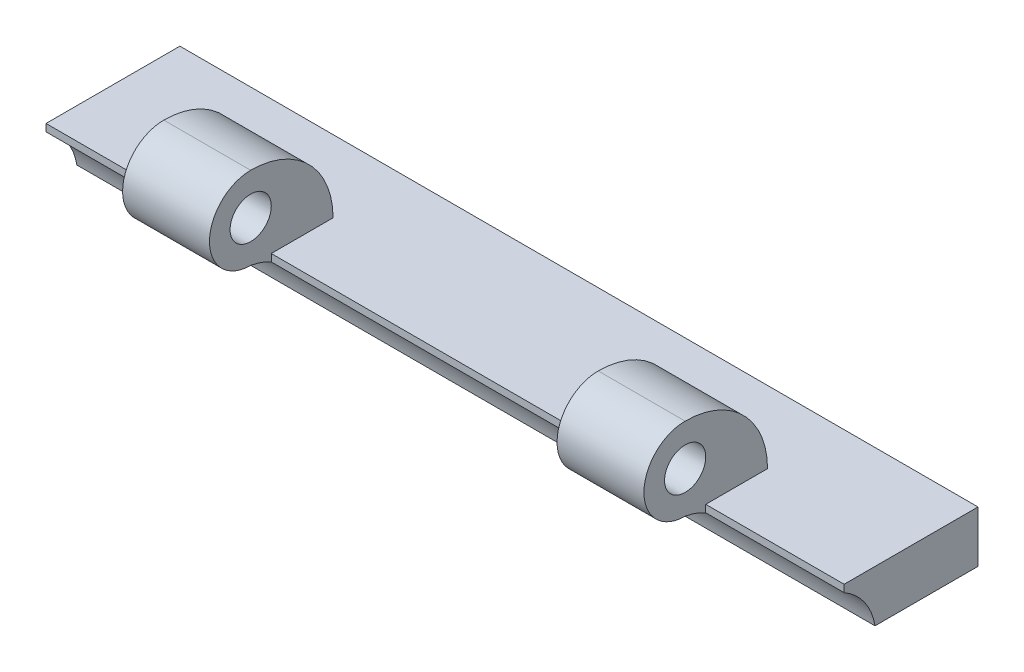
ISO-10303-21;
HEADER;
FILE_DESCRIPTION(('STEP AP214'),'2;1');
FILE_NAME('part.step','',(''),(''),'','','');
FILE_SCHEMA(('AUTOMOTIVE_DESIGN { 1 0 10303 214 1 1 1 1 }'));
ENDSEC;
DATA;
#1=APPLICATION_CONTEXT('core data for automotive mechanical design processes');
#2=APPLICATION_PROTOCOL_DEFINITION('international standard','automotive_design',2000,#1);
#3=PRODUCT_CONTEXT('',#1,'mechanical');
#4=PRODUCT('Part','Part','',(#3));
#5=PRODUCT_RELATED_PRODUCT_CATEGORY('part','',(#4));
#6=PRODUCT_DEFINITION_FORMATION('','',#4);
#7=PRODUCT_DEFINITION_CONTEXT('part definition',#1,'design');
#8=PRODUCT_DEFINITION('design','',#6,#7);
#9=PRODUCT_DEFINITION_SHAPE('','',#8);
#10=(LENGTH_UNIT() NAMED_UNIT(*) SI_UNIT(.MILLI.,.METRE.));
#11=(NAMED_UNIT(*) PLANE_ANGLE_UNIT() SI_UNIT($,.RADIAN.));
#12=(NAMED_UNIT(*) SI_UNIT($,.STERADIAN.) SOLID_ANGLE_UNIT());
#13=UNCERTAINTY_MEASURE_WITH_UNIT(LENGTH_MEASURE(1.E-05),#10,'distance_accuracy_value','');
#14=(GEOMETRIC_REPRESENTATION_CONTEXT(3) GLOBAL_UNCERTAINTY_ASSIGNED_CONTEXT((#13)) GLOBAL_UNIT_ASSIGNED_CONTEXT((#10,
#11,#12)) REPRESENTATION_CONTEXT('',''));
#15=CARTESIAN_POINT('',(0.,0.,0.));
#16=DIRECTION('',(0.,0.,1.));
#17=DIRECTION('',(1.,0.,0.));
#18=AXIS2_PLACEMENT_3D('',#15,#16,#17);
#19=CARTESIAN_POINT('',(-12.4387503050269,4.,75.1454545454545));
#20=DIRECTION('',(0.,0.,-1.));
#21=DIRECTION('',(-1.,0.,0.));
#22=AXIS2_PLACEMENT_3D('',#19,#20,#21);
#23=PLANE('',#22);
#24=DIRECTION('',(-1.,0.,0.));
#25=VECTOR('',#24,1.);
#26=CARTESIAN_POINT('',(-12.4387503050269,4.,75.1454545454545));
#27=LINE('',#26,#25);
#28=CARTESIAN_POINT('',(-23.75,4.,75.1454545454545));
#29=VERTEX_POINT('',#28);
#30=CARTESIAN_POINT('',(-37.25,4.,75.1454545454545));
#31=VERTEX_POINT('',#30);
#32=EDGE_CURVE('E170',#29,#31,#27,.T.);
#33=ORIENTED_EDGE('',*,*,#32,.T.);
#34=DIRECTION('',(0.,-1.,0.));
#35=VECTOR('',#34,1.);
#36=CARTESIAN_POINT('',(-37.25,0.,75.1454545454545));
#37=LINE('',#36,#35);
#38=CARTESIAN_POINT('',(-37.25,3.71660104885167,75.1454545454545));
#39=VERTEX_POINT('',#38);
#40=EDGE_CURVE('E152',#31,#39,#37,.T.);
#41=ORIENTED_EDGE('',*,*,#40,.T.);
#42=DIRECTION('',(1.,0.,0.));
#43=VECTOR('',#42,1.);
#44=CARTESIAN_POINT('',(-50.4721359549996,3.71660104885167,75.1454545454545));
#45=LINE('',#44,#43);
#46=CARTESIAN_POINT('',(-23.75,3.71660104885167,75.1454545454545));
#47=VERTEX_POINT('',#46);
#48=EDGE_CURVE('E245',#47,#39,#45,.F.);
#49=ORIENTED_EDGE('',*,*,#48,.F.);
#50=DIRECTION('',(0.,1.,0.));
#51=VECTOR('',#50,1.);
#52=CARTESIAN_POINT('',(-23.75,0.,75.1454545454545));
#53=LINE('',#52,#51);
#54=EDGE_CURVE('E176',#47,#29,#53,.T.);
#55=ORIENTED_EDGE('',*,*,#54,.T.);
#56=EDGE_LOOP('',(#33,#41,#49,#55));
#57=FACE_BOUND('',#56,.T.);
#58=ADVANCED_FACE('F42',(#57),#23,.F.);
#59=CARTESIAN_POINT('',(-15.,4.,75.1454545454545));
#60=VERTEX_POINT('',#59);
#61=CARTESIAN_POINT('',(-20.375,4.,75.1454545454545));
#62=VERTEX_POINT('',#61);
#63=EDGE_CURVE('E178',#60,#62,#27,.T.);
#64=ORIENTED_EDGE('',*,*,#63,.T.);
#65=DIRECTION('',(0.,-1.,0.));
#66=VECTOR('',#65,1.);
#67=CARTESIAN_POINT('',(-20.375,0.,75.1454545454545));
#68=LINE('',#67,#66);
#69=CARTESIAN_POINT('',(-20.375,3.71660104885167,75.1454545454545));
#70=VERTEX_POINT('',#69);
#71=EDGE_CURVE('E270',#62,#70,#68,.T.);
#72=ORIENTED_EDGE('',*,*,#71,.T.);
#73=CARTESIAN_POINT('',(-15.,3.71660104885167,75.1454545454545));
#74=VERTEX_POINT('',#73);
#75=EDGE_CURVE('E242',#74,#70,#45,.F.);
#76=ORIENTED_EDGE('',*,*,#75,.F.);
#77=DIRECTION('',(0.,1.,0.));
#78=VECTOR('',#77,1.);
#79=CARTESIAN_POINT('',(-15.,4.,75.1454545454545));
#80=LINE('',#79,#78);
#81=EDGE_CURVE('E182',#74,#60,#80,.T.);
#82=ORIENTED_EDGE('',*,*,#81,.T.);
#83=EDGE_LOOP('',(#64,#72,#76,#82));
#84=FACE_BOUND('',#83,.T.);
#85=ADVANCED_FACE('F317',(#84),#23,.F.);
#86=CARTESIAN_POINT('',(-46.,4.,64.1454545454545));
#87=DIRECTION('',(1.,0.,0.));
#88=DIRECTION('',(0.,0.,-1.));
#89=AXIS2_PLACEMENT_3D('',#86,#87,#88);
#90=PLANE('',#89);
#91=CARTESIAN_POINT('',(-46.,1.59999999999998,76.3454545454545));
#92=DIRECTION('',(1.,0.,0.));
#93=DIRECTION('',(0.,0.,-1.));
#94=AXIS2_PLACEMENT_3D('',#91,#92,#93);
#95=CIRCLE('',#94,2.43310501211931);
#96=CARTESIAN_POINT('',(-46.,2.,73.9454545454545));
#97=VERTEX_POINT('',#96);
#98=CARTESIAN_POINT('',(-46.,3.71660104885167,75.1454545454545));
#99=VERTEX_POINT('',#98);
#100=EDGE_CURVE('E247',#97,#99,#95,.T.);
#101=ORIENTED_EDGE('',*,*,#100,.T.);
#102=DIRECTION('',(0.,-1.,0.));
#103=VECTOR('',#102,1.);
#104=CARTESIAN_POINT('',(-46.,4.,75.1454545454545));
#105=LINE('',#104,#103);
#106=CARTESIAN_POINT('',(-46.,4.,75.1454545454545));
#107=VERTEX_POINT('',#106);
#108=EDGE_CURVE('E184',#107,#99,#105,.T.);
#109=ORIENTED_EDGE('',*,*,#108,.F.);
#110=DIRECTION('',(0.,0.,1.));
#111=VECTOR('',#110,1.);
#112=CARTESIAN_POINT('',(-46.,4.,64.1454545454545));
#113=LINE('',#112,#111);
#114=CARTESIAN_POINT('',(-46.,4.,69.9454545454545));
#115=VERTEX_POINT('',#114);
#116=EDGE_CURVE('E51',#115,#107,#113,.T.);
#117=ORIENTED_EDGE('',*,*,#116,.F.);
#118=DIRECTION('',(0.,1.,0.));
#119=VECTOR('',#118,1.);
#120=CARTESIAN_POINT('',(-46.,4.,69.9454545454545));
#121=LINE('',#120,#119);
#122=CARTESIAN_POINT('',(-46.,2.,69.9454545454545));
#123=VERTEX_POINT('',#122);
#124=EDGE_CURVE('E255',#123,#115,#121,.T.);
#125=ORIENTED_EDGE('',*,*,#124,.F.);
#126=DIRECTION('',(0.,0.,1.));
#127=VECTOR('',#126,1.);
#128=CARTESIAN_POINT('',(-46.,2.,64.1454545454545));
#129=LINE('',#128,#127);
#130=EDGE_CURVE('E188',#123,#97,#129,.T.);
#131=ORIENTED_EDGE('',*,*,#130,.T.);
#132=EDGE_LOOP('',(#101,#109,#117,#125,#131));
#133=FACE_BOUND('',#132,.T.);
#134=ADVANCED_FACE('F44',(#133),#90,.F.);
#135=CARTESIAN_POINT('',(-15.,4.,64.1454545454545));
#136=DIRECTION('',(-1.,0.,0.));
#137=DIRECTION('',(0.,0.,1.));
#138=AXIS2_PLACEMENT_3D('',#135,#136,#137);
#139=PLANE('',#138);
#140=CARTESIAN_POINT('',(-15.,1.59999999999998,76.3454545454545));
#141=DIRECTION('',(1.,0.,0.));
#142=DIRECTION('',(0.,0.,-1.));
#143=AXIS2_PLACEMENT_3D('',#140,#141,#142);
#144=CIRCLE('',#143,2.43310501211931);
#145=CARTESIAN_POINT('',(-15.,2.,73.9454545454545));
#146=VERTEX_POINT('',#145);
#147=EDGE_CURVE('E59',#74,#146,#144,.F.);
#148=ORIENTED_EDGE('',*,*,#147,.T.);
#149=DIRECTION('',(0.,0.,-1.));
#150=VECTOR('',#149,1.);
#151=CARTESIAN_POINT('',(-15.,2.,64.1454545454545));
#152=LINE('',#151,#150);
#153=CARTESIAN_POINT('',(-15.,2.,69.9454545454545));
#154=VERTEX_POINT('',#153);
#155=EDGE_CURVE('E46',#146,#154,#152,.T.);
#156=ORIENTED_EDGE('',*,*,#155,.T.);
#157=DIRECTION('',(0.,-1.,0.));
#158=VECTOR('',#157,1.);
#159=CARTESIAN_POINT('',(-15.,4.,69.9454545454545));
#160=LINE('',#159,#158);
#161=CARTESIAN_POINT('',(-15.,4.,69.9454545454545));
#162=VERTEX_POINT('',#161);
#163=EDGE_CURVE('E261',#162,#154,#160,.T.);
#164=ORIENTED_EDGE('',*,*,#163,.F.);
#165=DIRECTION('',(0.,0.,-1.));
#166=VECTOR('',#165,1.);
#167=CARTESIAN_POINT('',(-15.,4.,64.1454545454545));
#168=LINE('',#167,#166);
#169=EDGE_CURVE('E11',#60,#162,#168,.T.);
#170=ORIENTED_EDGE('',*,*,#169,.F.);
#171=ORIENTED_EDGE('',*,*,#81,.F.);
#172=EDGE_LOOP('',(#148,#156,#164,#170,#171));
#173=FACE_BOUND('',#172,.T.);
#174=ADVANCED_FACE('F304',(#173),#139,.F.);
#175=CARTESIAN_POINT('',(0.,2.,0.));
#176=DIRECTION('',(0.,1.,0.));
#177=DIRECTION('',(0.,0.,1.));
#178=AXIS2_PLACEMENT_3D('',#175,#176,#177);
#179=PLANE('',#178);
#180=DIRECTION('',(1.,0.,0.));
#181=VECTOR('',#180,1.);
#182=CARTESIAN_POINT('',(-50.4721359549996,2.,73.9454545454545));
#183=LINE('',#182,#181);
#184=EDGE_CURVE('E249',#97,#146,#183,.T.);
#185=ORIENTED_EDGE('',*,*,#184,.F.);
#186=ORIENTED_EDGE('',*,*,#130,.F.);
#187=DIRECTION('',(-1.,0.,0.));
#188=VECTOR('',#187,1.);
#189=CARTESIAN_POINT('',(-15.,2.,69.9454545454545));
#190=LINE('',#189,#188);
#191=EDGE_CURVE('E258',#154,#123,#190,.T.);
#192=ORIENTED_EDGE('',*,*,#191,.F.);
#193=ORIENTED_EDGE('',*,*,#155,.F.);
#194=EDGE_LOOP('',(#185,#186,#192,#193));
#195=FACE_BOUND('',#194,.T.);
#196=ADVANCED_FACE('F300',(#195),#179,.F.);
#197=CARTESIAN_POINT('',(-40.625,3.71660104885167,75.1454545454545));
#198=VERTEX_POINT('',#197);
#199=EDGE_CURVE('E246',#198,#99,#45,.F.);
#200=ORIENTED_EDGE('',*,*,#199,.F.);
#201=DIRECTION('',(0.,1.,0.));
#202=VECTOR('',#201,1.);
#203=CARTESIAN_POINT('',(-40.625,0.,75.1454545454545));
#204=LINE('',#203,#202);
#205=CARTESIAN_POINT('',(-40.625,4.,75.1454545454545));
#206=VERTEX_POINT('',#205);
#207=EDGE_CURVE('E164',#198,#206,#204,.T.);
#208=ORIENTED_EDGE('',*,*,#207,.T.);
#209=EDGE_CURVE('E179',#206,#107,#27,.T.);
#210=ORIENTED_EDGE('',*,*,#209,.T.);
#211=ORIENTED_EDGE('',*,*,#108,.T.);
#212=EDGE_LOOP('',(#200,#208,#210,#211));
#213=FACE_BOUND('',#212,.T.);
#214=ADVANCED_FACE('F294',(#213),#23,.F.);
#215=CARTESIAN_POINT('',(0.,4.,0.));
#216=DIRECTION('',(0.,1.,0.));
#217=DIRECTION('',(0.,0.,1.));
#218=AXIS2_PLACEMENT_3D('',#215,#216,#217);
#219=PLANE('',#218);
#220=ORIENTED_EDGE('',*,*,#169,.T.);
#221=DIRECTION('',(1.,0.,0.));
#222=VECTOR('',#221,1.);
#223=CARTESIAN_POINT('',(-15.,4.,69.9454545454545));
#224=LINE('',#223,#222);
#225=EDGE_CURVE('E252',#115,#162,#224,.T.);
#226=ORIENTED_EDGE('',*,*,#225,.F.);
#227=ORIENTED_EDGE('',*,*,#116,.T.);
#228=ORIENTED_EDGE('',*,*,#209,.F.);
#229=DIRECTION('',(0.,0.,1.));
#230=VECTOR('',#229,1.);
#231=CARTESIAN_POINT('',(-40.625,4.,75.9454545454545));
#232=LINE('',#231,#230);
#233=CARTESIAN_POINT('',(-40.625,4.,72.7454545454545));
#234=VERTEX_POINT('',#233);
#235=EDGE_CURVE('E174',#234,#206,#232,.T.);
#236=ORIENTED_EDGE('',*,*,#235,.F.);
#237=DIRECTION('',(-1.,0.,0.));
#238=VECTOR('',#237,1.);
#239=CARTESIAN_POINT('',(-12.4745166004061,4.,72.7454545454545));
#240=LINE('',#239,#238);
#241=CARTESIAN_POINT('',(-37.25,4.,72.7454545454545));
#242=VERTEX_POINT('',#241);
#243=EDGE_CURVE('E172',#242,#234,#240,.T.);
#244=ORIENTED_EDGE('',*,*,#243,.F.);
#245=DIRECTION('',(0.,0.,1.));
#246=VECTOR('',#245,1.);
#247=CARTESIAN_POINT('',(-37.25,4.,75.9454545454545));
#248=LINE('',#247,#246);
#249=EDGE_CURVE('E156',#242,#31,#248,.T.);
#250=ORIENTED_EDGE('',*,*,#249,.T.);
#251=ORIENTED_EDGE('',*,*,#32,.F.);
#252=DIRECTION('',(0.,0.,1.));
#253=VECTOR('',#252,1.);
#254=CARTESIAN_POINT('',(-23.75,4.,75.9454545454545));
#255=LINE('',#254,#253);
#256=CARTESIAN_POINT('',(-23.75,4.,72.7454545454545));
#257=VERTEX_POINT('',#256);
#258=EDGE_CURVE('E207',#257,#29,#255,.T.);
#259=ORIENTED_EDGE('',*,*,#258,.F.);
#260=DIRECTION('',(-1.,0.,0.));
#261=VECTOR('',#260,1.);
#262=CARTESIAN_POINT('',(-12.4745166004061,4.,72.7454545454545));
#263=LINE('',#262,#261);
#264=CARTESIAN_POINT('',(-20.375,4.,72.7454545454545));
#265=VERTEX_POINT('',#264);
#266=EDGE_CURVE('E209',#265,#257,#263,.T.);
#267=ORIENTED_EDGE('',*,*,#266,.F.);
#268=DIRECTION('',(0.,0.,1.));
#269=VECTOR('',#268,1.);
#270=CARTESIAN_POINT('',(-20.375,4.,75.9454545454545));
#271=LINE('',#270,#269);
#272=EDGE_CURVE('E201',#265,#62,#271,.T.);
#273=ORIENTED_EDGE('',*,*,#272,.T.);
#274=ORIENTED_EDGE('',*,*,#63,.F.);
#275=EDGE_LOOP('',(#220,#226,#227,#228,#236,#244,#250,#251,#259,#267,#273,#274));
#276=FACE_BOUND('',#275,.T.);
#277=ADVANCED_FACE('F168',(#276),#219,.T.);
#278=CARTESIAN_POINT('',(-12.4745166004061,3.99999999999996,75.9454545454545));
#279=DIRECTION('',(-1.,0.,0.));
#280=DIRECTION('',(0.,0.,1.));
#281=AXIS2_PLACEMENT_3D('',#278,#279,#280);
#282=CYLINDRICAL_SURFACE('',#281,3.2);
#283=ORIENTED_EDGE('',*,*,#266,.T.);
#284=CARTESIAN_POINT('',(-23.75,3.99999999999996,75.9454545454545));
#285=DIRECTION('',(1.,0.,0.));
#286=DIRECTION('',(0.,0.,-1.));
#287=AXIS2_PLACEMENT_3D('',#284,#285,#286);
#288=CIRCLE('',#287,3.2);
#289=CARTESIAN_POINT('',(-23.75,7.2,75.9454545454545));
#290=VERTEX_POINT('',#289);
#291=EDGE_CURVE('E213',#257,#290,#288,.T.);
#292=ORIENTED_EDGE('',*,*,#291,.T.);
#293=DIRECTION('',(-1.,0.,0.));
#294=VECTOR('',#293,1.);
#295=CARTESIAN_POINT('',(-12.4745166004061,7.2,75.9454545454545));
#296=LINE('',#295,#294);
#297=CARTESIAN_POINT('',(-20.375,7.2,75.9454545454545));
#298=VERTEX_POINT('',#297);
#299=EDGE_CURVE('E215',#298,#290,#296,.T.);
#300=ORIENTED_EDGE('',*,*,#299,.F.);
#301=CARTESIAN_POINT('',(-20.375,3.99999999999996,75.9454545454545));
#302=DIRECTION('',(1.,0.,0.));
#303=DIRECTION('',(0.,0.,-1.));
#304=AXIS2_PLACEMENT_3D('',#301,#302,#303);
#305=CIRCLE('',#304,3.2);
#306=EDGE_CURVE('E210',#265,#298,#305,.T.);
#307=ORIENTED_EDGE('',*,*,#306,.F.);
#308=EDGE_LOOP('',(#283,#292,#300,#307));
#309=FACE_BOUND('',#308,.T.);
#310=ADVANCED_FACE('F329',(#309),#282,.T.);
#311=CARTESIAN_POINT('',(-50.5254833995939,5.6,75.9454545454545));
#312=DIRECTION('',(1.,0.,0.));
#313=DIRECTION('',(0.,0.,-1.));
#314=AXIS2_PLACEMENT_3D('',#311,#312,#313);
#315=CYLINDRICAL_SURFACE('',#314,1.60000000000001);
#316=CARTESIAN_POINT('',(-20.375,5.6,75.9454545454545));
#317=DIRECTION('',(1.,0.,0.));
#318=DIRECTION('',(0.,0.,-1.));
#319=AXIS2_PLACEMENT_3D('',#316,#317,#318);
#320=CIRCLE('',#319,1.60000000000001);
#321=CARTESIAN_POINT('',(-20.375,4.,75.9454545454545));
#322=VERTEX_POINT('',#321);
#323=EDGE_CURVE('E214',#322,#298,#320,.F.);
#324=ORIENTED_EDGE('',*,*,#323,.T.);
#325=ORIENTED_EDGE('',*,*,#299,.T.);
#326=CARTESIAN_POINT('',(-23.75,5.6,75.9454545454545));
#327=DIRECTION('',(1.,0.,0.));
#328=DIRECTION('',(0.,0.,-1.));
#329=AXIS2_PLACEMENT_3D('',#326,#327,#328);
#330=CIRCLE('',#329,1.60000000000001);
#331=CARTESIAN_POINT('',(-23.75,4.,75.9454545454545));
#332=VERTEX_POINT('',#331);
#333=EDGE_CURVE('E204',#332,#290,#330,.F.);
#334=ORIENTED_EDGE('',*,*,#333,.F.);
#335=DIRECTION('',(1.,0.,0.));
#336=VECTOR('',#335,1.);
#337=CARTESIAN_POINT('',(-46.8487137123388,4.,75.9454545454545));
#338=LINE('',#337,#336);
#339=EDGE_CURVE('E264',#332,#322,#338,.T.);
#340=ORIENTED_EDGE('',*,*,#339,.T.);
#341=EDGE_LOOP('',(#324,#325,#334,#340));
#342=FACE_BOUND('',#341,.T.);
#343=ADVANCED_FACE('F413',(#342),#315,.T.);
#344=CARTESIAN_POINT('',(-14.737258300203,5.6,75.9454545454545));
#345=DIRECTION('',(-1.,0.,0.));
#346=DIRECTION('',(0.,0.,1.));
#347=AXIS2_PLACEMENT_3D('',#344,#345,#346);
#348=CYLINDRICAL_SURFACE('',#347,0.80000000000001);
#349=CARTESIAN_POINT('',(-23.75,5.6,75.9454545454545));
#350=DIRECTION('',(1.,0.,0.));
#351=DIRECTION('',(0.,0.,-1.));
#352=AXIS2_PLACEMENT_3D('',#349,#350,#351);
#353=CIRCLE('',#352,0.80000000000001);
#354=CARTESIAN_POINT('',(-23.75,5.6,75.1454545454545));
#355=VERTEX_POINT('',#354);
#356=EDGE_CURVE('E197',#355,#355,#353,.F.);
#357=ORIENTED_EDGE('',*,*,#356,.T.);
#358=EDGE_LOOP('',(#357));
#359=FACE_BOUND('',#358,.T.);
#360=CARTESIAN_POINT('',(-20.375,5.6,75.9454545454545));
#361=DIRECTION('',(1.,0.,0.));
#362=DIRECTION('',(0.,0.,-1.));
#363=AXIS2_PLACEMENT_3D('',#360,#361,#362);
#364=CIRCLE('',#363,0.80000000000001);
#365=CARTESIAN_POINT('',(-20.375,5.6,75.1454545454545));
#366=VERTEX_POINT('',#365);
#367=EDGE_CURVE('E200',#366,#366,#364,.F.);
#368=ORIENTED_EDGE('',*,*,#367,.F.);
#369=EDGE_LOOP('',(#368));
#370=FACE_BOUND('',#369,.T.);
#371=ADVANCED_FACE('F407',(#359,#370),#348,.F.);
#372=CARTESIAN_POINT('',(-23.75,0.,0.));
#373=DIRECTION('',(1.,0.,0.));
#374=DIRECTION('',(0.,0.,-1.));
#375=AXIS2_PLACEMENT_3D('',#372,#373,#374);
#376=PLANE('',#375);
#377=ORIENTED_EDGE('',*,*,#258,.T.);
#378=ORIENTED_EDGE('',*,*,#54,.F.);
#379=CARTESIAN_POINT('',(-23.75,1.59999999999838,76.3454545454557));
#380=DIRECTION('',(1.,0.,0.));
#381=DIRECTION('',(0.,0.,-1.));
#382=AXIS2_PLACEMENT_3D('',#379,#380,#381);
#383=CIRCLE('',#382,2.43310501212069);
#384=EDGE_CURVE('E267',#332,#47,#383,.F.);
#385=ORIENTED_EDGE('',*,*,#384,.F.);
#386=ORIENTED_EDGE('',*,*,#333,.T.);
#387=ORIENTED_EDGE('',*,*,#291,.F.);
#388=EDGE_LOOP('',(#377,#378,#385,#386,#387));
#389=FACE_BOUND('',#388,.T.);
#390=ORIENTED_EDGE('',*,*,#356,.F.);
#391=EDGE_LOOP('',(#390));
#392=FACE_BOUND('',#391,.T.);
#393=ADVANCED_FACE('F399',(#389,#392),#376,.F.);
#394=CARTESIAN_POINT('',(-20.375,0.,0.));
#395=DIRECTION('',(1.,0.,0.));
#396=DIRECTION('',(0.,0.,-1.));
#397=AXIS2_PLACEMENT_3D('',#394,#395,#396);
#398=PLANE('',#397);
#399=ORIENTED_EDGE('',*,*,#306,.T.);
#400=ORIENTED_EDGE('',*,*,#323,.F.);
#401=CARTESIAN_POINT('',(-20.375,1.59999999999838,76.3454545454557));
#402=DIRECTION('',(-1.,0.,0.));
#403=DIRECTION('',(0.,0.,1.));
#404=AXIS2_PLACEMENT_3D('',#401,#402,#403);
#405=CIRCLE('',#404,2.43310501212069);
#406=EDGE_CURVE('E269',#70,#322,#405,.F.);
#407=ORIENTED_EDGE('',*,*,#406,.F.);
#408=ORIENTED_EDGE('',*,*,#71,.F.);
#409=ORIENTED_EDGE('',*,*,#272,.F.);
#410=EDGE_LOOP('',(#399,#400,#407,#408,#409));
#411=FACE_BOUND('',#410,.T.);
#412=ORIENTED_EDGE('',*,*,#367,.T.);
#413=EDGE_LOOP('',(#412));
#414=FACE_BOUND('',#413,.T.);
#415=ADVANCED_FACE('F330',(#411,#414),#398,.T.);
#416=CARTESIAN_POINT('',(-12.4745166004061,3.99999999999996,75.9454545454545));
#417=DIRECTION('',(-1.,0.,0.));
#418=DIRECTION('',(0.,0.,1.));
#419=AXIS2_PLACEMENT_3D('',#416,#417,#418);
#420=CYLINDRICAL_SURFACE('',#419,3.2);
#421=CARTESIAN_POINT('',(-37.25,3.99999999999996,75.9454545454545));
#422=DIRECTION('',(1.,0.,0.));
#423=DIRECTION('',(0.,0.,-1.));
#424=AXIS2_PLACEMENT_3D('',#421,#422,#423);
#425=CIRCLE('',#424,3.2);
#426=CARTESIAN_POINT('',(-37.25,7.2,75.9454545454545));
#427=VERTEX_POINT('',#426);
#428=EDGE_CURVE('E67',#242,#427,#425,.T.);
#429=ORIENTED_EDGE('',*,*,#428,.F.);
#430=ORIENTED_EDGE('',*,*,#243,.T.);
#431=CARTESIAN_POINT('',(-40.625,3.99999999999996,75.9454545454545));
#432=DIRECTION('',(1.,0.,0.));
#433=DIRECTION('',(0.,0.,-1.));
#434=AXIS2_PLACEMENT_3D('',#431,#432,#433);
#435=CIRCLE('',#434,3.2);
#436=CARTESIAN_POINT('',(-40.625,7.2,75.9454545454545));
#437=VERTEX_POINT('',#436);
#438=EDGE_CURVE('E233',#234,#437,#435,.T.);
#439=ORIENTED_EDGE('',*,*,#438,.T.);
#440=DIRECTION('',(-1.,0.,0.));
#441=VECTOR('',#440,1.);
#442=CARTESIAN_POINT('',(-12.4745166004061,7.2,75.9454545454545));
#443=LINE('',#442,#441);
#444=EDGE_CURVE('E235',#427,#437,#443,.T.);
#445=ORIENTED_EDGE('',*,*,#444,.F.);
#446=EDGE_LOOP('',(#429,#430,#439,#445));
#447=FACE_BOUND('',#446,.T.);
#448=ADVANCED_FACE('F315',(#447),#420,.T.);
#449=CARTESIAN_POINT('',(-50.5254833995939,5.6,75.9454545454545));
#450=DIRECTION('',(1.,0.,0.));
#451=DIRECTION('',(0.,0.,-1.));
#452=AXIS2_PLACEMENT_3D('',#449,#450,#451);
#453=CYLINDRICAL_SURFACE('',#452,1.60000000000001);
#454=ORIENTED_EDGE('',*,*,#444,.T.);
#455=CARTESIAN_POINT('',(-40.625,5.6,75.9454545454545));
#456=DIRECTION('',(1.,0.,0.));
#457=DIRECTION('',(0.,0.,-1.));
#458=AXIS2_PLACEMENT_3D('',#455,#456,#457);
#459=CIRCLE('',#458,1.60000000000001);
#460=CARTESIAN_POINT('',(-40.625,4.,75.9454545454545));
#461=VERTEX_POINT('',#460);
#462=EDGE_CURVE('E224',#461,#437,#459,.F.);
#463=ORIENTED_EDGE('',*,*,#462,.F.);
#464=DIRECTION('',(1.,0.,0.));
#465=VECTOR('',#464,1.);
#466=CARTESIAN_POINT('',(-46.8487137123388,4.,75.9454545454545));
#467=LINE('',#466,#465);
#468=CARTESIAN_POINT('',(-37.25,4.,75.9454545454545));
#469=VERTEX_POINT('',#468);
#470=EDGE_CURVE('E276',#461,#469,#467,.T.);
#471=ORIENTED_EDGE('',*,*,#470,.T.);
#472=CARTESIAN_POINT('',(-37.25,5.6,75.9454545454545));
#473=DIRECTION('',(1.,0.,0.));
#474=DIRECTION('',(0.,0.,-1.));
#475=AXIS2_PLACEMENT_3D('',#472,#473,#474);
#476=CIRCLE('',#475,1.60000000000001);
#477=EDGE_CURVE('E234',#469,#427,#476,.F.);
#478=ORIENTED_EDGE('',*,*,#477,.T.);
#479=EDGE_LOOP('',(#454,#463,#471,#478));
#480=FACE_BOUND('',#479,.T.);
#481=ADVANCED_FACE('F287',(#480),#453,.T.);
#482=CARTESIAN_POINT('',(-14.737258300203,5.6,75.9454545454545));
#483=DIRECTION('',(-1.,0.,0.));
#484=DIRECTION('',(0.,0.,1.));
#485=AXIS2_PLACEMENT_3D('',#482,#483,#484);
#486=CYLINDRICAL_SURFACE('',#485,0.80000000000001);
#487=CARTESIAN_POINT('',(-40.625,5.6,75.9454545454545));
#488=DIRECTION('',(1.,0.,0.));
#489=DIRECTION('',(0.,0.,-1.));
#490=AXIS2_PLACEMENT_3D('',#487,#488,#489);
#491=CIRCLE('',#490,0.80000000000001);
#492=CARTESIAN_POINT('',(-40.625,5.6,75.1454545454545));
#493=VERTEX_POINT('',#492);
#494=EDGE_CURVE('E173',#493,#493,#491,.F.);
#495=ORIENTED_EDGE('',*,*,#494,.T.);
#496=EDGE_LOOP('',(#495));
#497=FACE_BOUND('',#496,.T.);
#498=CARTESIAN_POINT('',(-37.25,5.6,75.9454545454545));
#499=DIRECTION('',(1.,0.,0.));
#500=DIRECTION('',(0.,0.,-1.));
#501=AXIS2_PLACEMENT_3D('',#498,#499,#500);
#502=CIRCLE('',#501,0.80000000000001);
#503=CARTESIAN_POINT('',(-37.25,5.6,75.1454545454545));
#504=VERTEX_POINT('',#503);
#505=EDGE_CURVE('E225',#504,#504,#502,.F.);
#506=ORIENTED_EDGE('',*,*,#505,.F.);
#507=EDGE_LOOP('',(#506));
#508=FACE_BOUND('',#507,.T.);
#509=ADVANCED_FACE('F384',(#497,#508),#486,.F.);
#510=CARTESIAN_POINT('',(-37.25,0.,0.));
#511=DIRECTION('',(1.,0.,0.));
#512=DIRECTION('',(0.,0.,-1.));
#513=AXIS2_PLACEMENT_3D('',#510,#511,#512);
#514=PLANE('',#513);
#515=ORIENTED_EDGE('',*,*,#428,.T.);
#516=ORIENTED_EDGE('',*,*,#477,.F.);
#517=CARTESIAN_POINT('',(-37.25,1.59999999999838,76.3454545454557));
#518=DIRECTION('',(-1.,0.,0.));
#519=DIRECTION('',(0.,0.,1.));
#520=AXIS2_PLACEMENT_3D('',#517,#518,#519);
#521=CIRCLE('',#520,2.43310501212069);
#522=EDGE_CURVE('E159',#39,#469,#521,.F.);
#523=ORIENTED_EDGE('',*,*,#522,.F.);
#524=ORIENTED_EDGE('',*,*,#40,.F.);
#525=ORIENTED_EDGE('',*,*,#249,.F.);
#526=EDGE_LOOP('',(#515,#516,#523,#524,#525));
#527=FACE_BOUND('',#526,.T.);
#528=ORIENTED_EDGE('',*,*,#505,.T.);
#529=EDGE_LOOP('',(#528));
#530=FACE_BOUND('',#529,.T.);
#531=ADVANCED_FACE('F154',(#527,#530),#514,.T.);
#532=CARTESIAN_POINT('',(-40.625,0.,0.));
#533=DIRECTION('',(1.,0.,0.));
#534=DIRECTION('',(0.,0.,-1.));
#535=AXIS2_PLACEMENT_3D('',#532,#533,#534);
#536=PLANE('',#535);
#537=ORIENTED_EDGE('',*,*,#235,.T.);
#538=ORIENTED_EDGE('',*,*,#207,.F.);
#539=CARTESIAN_POINT('',(-40.625,1.59999999999838,76.3454545454557));
#540=DIRECTION('',(1.,0.,0.));
#541=DIRECTION('',(0.,0.,-1.));
#542=AXIS2_PLACEMENT_3D('',#539,#540,#541);
#543=CIRCLE('',#542,2.43310501212069);
#544=EDGE_CURVE('E279',#461,#198,#543,.F.);
#545=ORIENTED_EDGE('',*,*,#544,.F.);
#546=ORIENTED_EDGE('',*,*,#462,.T.);
#547=ORIENTED_EDGE('',*,*,#438,.F.);
#548=EDGE_LOOP('',(#537,#538,#545,#546,#547));
#549=FACE_BOUND('',#548,.T.);
#550=ORIENTED_EDGE('',*,*,#494,.F.);
#551=EDGE_LOOP('',(#550));
#552=FACE_BOUND('',#551,.T.);
#553=ADVANCED_FACE('F289',(#549,#552),#536,.F.);
#554=CARTESIAN_POINT('',(-50.4721359549996,1.59999999999998,76.3454545454545));
#555=DIRECTION('',(1.,0.,0.));
#556=DIRECTION('',(0.,0.,-1.));
#557=AXIS2_PLACEMENT_3D('',#554,#555,#556);
#558=CYLINDRICAL_SURFACE('',#557,2.43310501211931);
#559=ORIENTED_EDGE('',*,*,#75,.T.);
#560=ORIENTED_EDGE('',*,*,#406,.T.);
#561=ORIENTED_EDGE('',*,*,#339,.F.);
#562=ORIENTED_EDGE('',*,*,#384,.T.);
#563=ORIENTED_EDGE('',*,*,#48,.T.);
#564=ORIENTED_EDGE('',*,*,#522,.T.);
#565=ORIENTED_EDGE('',*,*,#470,.F.);
#566=ORIENTED_EDGE('',*,*,#544,.T.);
#567=ORIENTED_EDGE('',*,*,#199,.T.);
#568=ORIENTED_EDGE('',*,*,#100,.F.);
#569=ORIENTED_EDGE('',*,*,#184,.T.);
#570=ORIENTED_EDGE('',*,*,#147,.F.);
#571=EDGE_LOOP('',(#559,#560,#561,#562,#563,#564,#565,#566,#567,#568,#569,#570));
#572=FACE_BOUND('',#571,.T.);
#573=ADVANCED_FACE('F284',(#572),#558,.F.);
#574=CARTESIAN_POINT('',(0.,0.,69.9454545454545));
#575=DIRECTION('',(0.,0.,-1.));
#576=DIRECTION('',(-1.,0.,0.));
#577=AXIS2_PLACEMENT_3D('',#574,#575,#576);
#578=PLANE('',#577);
#579=ORIENTED_EDGE('',*,*,#163,.T.);
#580=ORIENTED_EDGE('',*,*,#191,.T.);
#581=ORIENTED_EDGE('',*,*,#124,.T.);
#582=ORIENTED_EDGE('',*,*,#225,.T.);
#583=EDGE_LOOP('',(#579,#580,#581,#582));
#584=FACE_BOUND('',#583,.T.);
#585=ADVANCED_FACE('F308',(#584),#578,.T.);
#586=CLOSED_SHELL('',(#58,#85,#134,#174,#196,#214,#277,#310,#343,#371,#393,#415,#448,#481,#509,
#531,#553,#573,#585));
#587=MANIFOLD_SOLID_BREP('B2',#586);
#588=ADVANCED_BREP_SHAPE_REPRESENTATION('',(#18,#587),#14);
#589=SHAPE_DEFINITION_REPRESENTATION(#9,#588);
ENDSEC;
END-ISO-10303-21;
